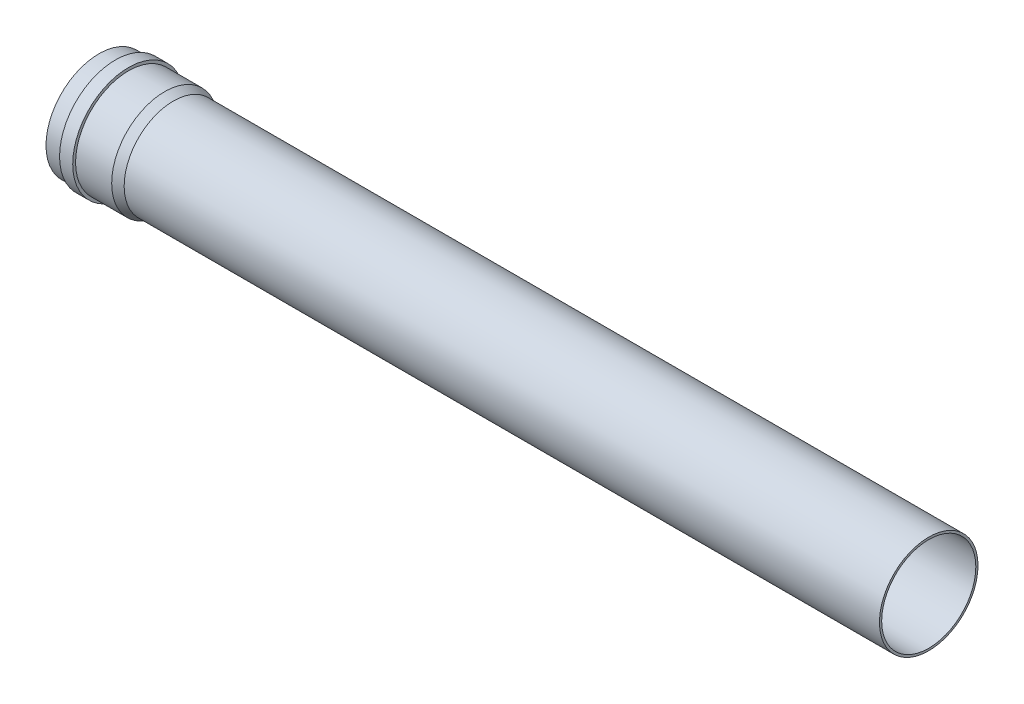
ISO-10303-21;
HEADER;
FILE_DESCRIPTION(('STEP AP214'),'2;1');
FILE_NAME('part.step','',(''),(''),'','','');
FILE_SCHEMA(('AUTOMOTIVE_DESIGN { 1 0 10303 214 1 1 1 1 }'));
ENDSEC;
DATA;
#1=APPLICATION_CONTEXT('core data for automotive mechanical design processes');
#2=APPLICATION_PROTOCOL_DEFINITION('international standard','automotive_design',2000,#1);
#3=PRODUCT_CONTEXT('',#1,'mechanical');
#4=PRODUCT('Part','Part','',(#3));
#5=PRODUCT_RELATED_PRODUCT_CATEGORY('part','',(#4));
#6=PRODUCT_DEFINITION_FORMATION('','',#4);
#7=PRODUCT_DEFINITION_CONTEXT('part definition',#1,'design');
#8=PRODUCT_DEFINITION('design','',#6,#7);
#9=PRODUCT_DEFINITION_SHAPE('','',#8);
#10=(LENGTH_UNIT() NAMED_UNIT(*) SI_UNIT(.MILLI.,.METRE.));
#11=(NAMED_UNIT(*) PLANE_ANGLE_UNIT() SI_UNIT($,.RADIAN.));
#12=(NAMED_UNIT(*) SI_UNIT($,.STERADIAN.) SOLID_ANGLE_UNIT());
#13=UNCERTAINTY_MEASURE_WITH_UNIT(LENGTH_MEASURE(1.E-05),#10,'distance_accuracy_value','');
#14=(GEOMETRIC_REPRESENTATION_CONTEXT(3) GLOBAL_UNCERTAINTY_ASSIGNED_CONTEXT((#13)) GLOBAL_UNIT_ASSIGNED_CONTEXT((#10,
#11,#12)) REPRESENTATION_CONTEXT('',''));
#15=CARTESIAN_POINT('',(0.,0.,0.));
#16=DIRECTION('',(0.,0.,1.));
#17=DIRECTION('',(1.,0.,0.));
#18=AXIS2_PLACEMENT_3D('',#15,#16,#17);
#19=CARTESIAN_POINT('',(-41.,0.,0.));
#20=DIRECTION('',(-1.,0.,0.));
#21=DIRECTION('',(0.,0.,1.));
#22=AXIS2_PLACEMENT_3D('',#19,#20,#21);
#23=CYLINDRICAL_SURFACE('',#22,51.);
#24=CARTESIAN_POINT('',(-41.,0.,0.));
#25=DIRECTION('',(-1.,0.,0.));
#26=DIRECTION('',(0.,0.,1.));
#27=AXIS2_PLACEMENT_3D('',#24,#25,#26);
#28=CIRCLE('',#27,51.);
#29=CARTESIAN_POINT('',(-41.,0.,51.));
#30=VERTEX_POINT('',#29);
#31=EDGE_CURVE('E11',#30,#30,#28,.T.);
#32=ORIENTED_EDGE('',*,*,#31,.T.);
#33=EDGE_LOOP('',(#32));
#34=FACE_BOUND('',#33,.T.);
#35=CARTESIAN_POINT('',(-53.,0.,0.));
#36=DIRECTION('',(-1.,0.,0.));
#37=DIRECTION('',(0.,0.,1.));
#38=AXIS2_PLACEMENT_3D('',#35,#36,#37);
#39=CIRCLE('',#38,51.);
#40=CARTESIAN_POINT('',(-53.,0.,51.));
#41=VERTEX_POINT('',#40);
#42=EDGE_CURVE('E52',#41,#41,#39,.T.);
#43=ORIENTED_EDGE('',*,*,#42,.F.);
#44=EDGE_LOOP('',(#43));
#45=FACE_BOUND('',#44,.T.);
#46=ADVANCED_FACE('F42',(#34,#45),#23,.T.);
#47=CARTESIAN_POINT('',(-41.,0.,0.));
#48=DIRECTION('',(-1.,0.,0.));
#49=DIRECTION('',(0.,0.,1.));
#50=AXIS2_PLACEMENT_3D('',#47,#48,#49);
#51=CYLINDRICAL_SURFACE('',#50,48.3957985296767);
#52=CARTESIAN_POINT('',(-41.,0.,0.));
#53=DIRECTION('',(-1.,0.,0.));
#54=DIRECTION('',(0.,0.,1.));
#55=AXIS2_PLACEMENT_3D('',#52,#53,#54);
#56=CIRCLE('',#55,48.3957985296767);
#57=CARTESIAN_POINT('',(-41.,0.,48.3957985296767));
#58=VERTEX_POINT('',#57);
#59=EDGE_CURVE('E48',#58,#58,#56,.T.);
#60=ORIENTED_EDGE('',*,*,#59,.F.);
#61=EDGE_LOOP('',(#60));
#62=FACE_BOUND('',#61,.T.);
#63=CARTESIAN_POINT('',(-53.,0.,0.));
#64=DIRECTION('',(-1.,0.,0.));
#65=DIRECTION('',(0.,0.,1.));
#66=AXIS2_PLACEMENT_3D('',#63,#64,#65);
#67=CIRCLE('',#66,48.3957985296767);
#68=CARTESIAN_POINT('',(-53.,0.,48.3957985296767));
#69=VERTEX_POINT('',#68);
#70=EDGE_CURVE('E56',#69,#69,#67,.T.);
#71=ORIENTED_EDGE('',*,*,#70,.T.);
#72=EDGE_LOOP('',(#71));
#73=FACE_BOUND('',#72,.T.);
#74=ADVANCED_FACE('F62',(#62,#73),#51,.F.);
#75=CARTESIAN_POINT('',(-41.,0.,0.));
#76=DIRECTION('',(-1.,0.,0.));
#77=DIRECTION('',(0.,0.,1.));
#78=AXIS2_PLACEMENT_3D('',#75,#76,#77);
#79=PLANE('',#78);
#80=ORIENTED_EDGE('',*,*,#59,.T.);
#81=EDGE_LOOP('',(#80));
#82=FACE_BOUND('',#81,.T.);
#83=ORIENTED_EDGE('',*,*,#31,.F.);
#84=EDGE_LOOP('',(#83));
#85=FACE_BOUND('',#84,.T.);
#86=ADVANCED_FACE('F67',(#82,#85),#79,.F.);
#87=CARTESIAN_POINT('',(-53.,0.,0.));
#88=DIRECTION('',(-1.,0.,0.));
#89=DIRECTION('',(0.,0.,1.));
#90=AXIS2_PLACEMENT_3D('',#87,#88,#89);
#91=PLANE('',#90);
#92=ORIENTED_EDGE('',*,*,#70,.F.);
#93=EDGE_LOOP('',(#92));
#94=FACE_BOUND('',#93,.T.);
#95=ORIENTED_EDGE('',*,*,#42,.T.);
#96=EDGE_LOOP('',(#95));
#97=FACE_BOUND('',#96,.T.);
#98=ADVANCED_FACE('F64',(#94,#97),#91,.T.);
#99=CLOSED_SHELL('',(#46,#74,#86,#98));
#100=MANIFOLD_SOLID_BREP('B2',#99);
#101=CARTESIAN_POINT('',(690.,0.,0.));
#102=DIRECTION('',(1.,0.,0.));
#103=DIRECTION('',(0.,0.,-1.));
#104=AXIS2_PLACEMENT_3D('',#101,#102,#103);
#105=PLANE('',#104);
#106=CARTESIAN_POINT('',(690.,0.,0.));
#107=DIRECTION('',(1.,0.,0.));
#108=DIRECTION('',(0.,0.,-1.));
#109=AXIS2_PLACEMENT_3D('',#106,#107,#108);
#110=CIRCLE('',#109,45.);
#111=CARTESIAN_POINT('',(690.,0.,-45.));
#112=VERTEX_POINT('',#111);
#113=EDGE_CURVE('E119',#112,#112,#110,.T.);
#114=ORIENTED_EDGE('',*,*,#113,.T.);
#115=EDGE_LOOP('',(#114));
#116=FACE_BOUND('',#115,.T.);
#117=CARTESIAN_POINT('',(690.,0.,0.));
#118=DIRECTION('',(1.,0.,0.));
#119=DIRECTION('',(0.,0.,-1.));
#120=AXIS2_PLACEMENT_3D('',#117,#118,#119);
#121=CIRCLE('',#120,43.);
#122=CARTESIAN_POINT('',(690.,0.,-43.));
#123=VERTEX_POINT('',#122);
#124=EDGE_CURVE('E125',#123,#123,#121,.T.);
#125=ORIENTED_EDGE('',*,*,#124,.F.);
#126=EDGE_LOOP('',(#125));
#127=FACE_BOUND('',#126,.T.);
#128=ADVANCED_FACE('F103',(#116,#127),#105,.T.);
#129=CARTESIAN_POINT('',(690.,0.,0.));
#130=DIRECTION('',(-1.,0.,0.));
#131=DIRECTION('',(0.,0.,1.));
#132=AXIS2_PLACEMENT_3D('',#129,#130,#131);
#133=CYLINDRICAL_SURFACE('',#132,45.);
#134=ORIENTED_EDGE('',*,*,#113,.F.);
#135=EDGE_LOOP('',(#134));
#136=FACE_BOUND('',#135,.T.);
#137=CARTESIAN_POINT('',(0.,0.,0.));
#138=DIRECTION('',(1.,0.,0.));
#139=DIRECTION('',(0.,0.,-1.));
#140=AXIS2_PLACEMENT_3D('',#137,#138,#139);
#141=CIRCLE('',#140,45.);
#142=CARTESIAN_POINT('',(0.,0.,-45.));
#143=VERTEX_POINT('',#142);
#144=EDGE_CURVE('E122',#143,#143,#141,.T.);
#145=ORIENTED_EDGE('',*,*,#144,.T.);
#146=EDGE_LOOP('',(#145));
#147=FACE_BOUND('',#146,.T.);
#148=ADVANCED_FACE('F154',(#136,#147),#133,.T.);
#149=CARTESIAN_POINT('',(690.,0.,0.));
#150=DIRECTION('',(-1.,0.,0.));
#151=DIRECTION('',(0.,0.,1.));
#152=AXIS2_PLACEMENT_3D('',#149,#150,#151);
#153=CYLINDRICAL_SURFACE('',#152,43.);
#154=CARTESIAN_POINT('',(-0.13887129133594,0.,0.));
#155=DIRECTION('',(-1.,0.,0.));
#156=DIRECTION('',(0.,0.,1.));
#157=AXIS2_PLACEMENT_3D('',#154,#155,#156);
#158=CIRCLE('',#157,43.);
#159=CARTESIAN_POINT('',(-0.13887129133594,0.,43.));
#160=VERTEX_POINT('',#159);
#161=EDGE_CURVE('E111',#160,#160,#158,.T.);
#162=ORIENTED_EDGE('',*,*,#161,.T.);
#163=EDGE_LOOP('',(#162));
#164=FACE_BOUND('',#163,.T.);
#165=ORIENTED_EDGE('',*,*,#124,.T.);
#166=EDGE_LOOP('',(#165));
#167=FACE_BOUND('',#166,.T.);
#168=ADVANCED_FACE('F160',(#164,#167),#153,.F.);
#169=CARTESIAN_POINT('',(-8.24548328038335,0.,0.));
#170=DIRECTION('',(-1.,0.,0.));
#171=DIRECTION('',(0.,0.,1.));
#172=AXIS2_PLACEMENT_3D('',#169,#170,#171);
#173=CONICAL_SURFACE('',#172,48.5,0.401425727958692);
#174=ORIENTED_EDGE('',*,*,#144,.F.);
#175=EDGE_LOOP('',(#174));
#176=FACE_BOUND('',#175,.T.);
#177=CARTESIAN_POINT('',(-8.,0.,0.));
#178=DIRECTION('',(-1.,0.,0.));
#179=DIRECTION('',(0.,0.,1.));
#180=AXIS2_PLACEMENT_3D('',#177,#178,#179);
#181=CIRCLE('',#180,48.3957985296767);
#182=CARTESIAN_POINT('',(-8.,0.,48.3957985296767));
#183=VERTEX_POINT('',#182);
#184=EDGE_CURVE('E115',#183,#183,#181,.T.);
#185=ORIENTED_EDGE('',*,*,#184,.F.);
#186=EDGE_LOOP('',(#185));
#187=FACE_BOUND('',#186,.T.);
#188=ADVANCED_FACE('F150',(#176,#187),#173,.T.);
#189=CARTESIAN_POINT('',(-0.13887129133594,0.,0.));
#190=DIRECTION('',(-1.,0.,0.));
#191=DIRECTION('',(0.,0.,1.));
#192=AXIS2_PLACEMENT_3D('',#189,#190,#191);
#193=CONICAL_SURFACE('',#192,43.,0.418879020478641);
#194=CARTESIAN_POINT('',(-8.,0.,0.));
#195=DIRECTION('',(-1.,0.,0.));
#196=DIRECTION('',(0.,0.,1.));
#197=AXIS2_PLACEMENT_3D('',#194,#195,#196);
#198=CIRCLE('',#197,46.4999999999997);
#199=CARTESIAN_POINT('',(-8.,0.,46.4999999999997));
#200=VERTEX_POINT('',#199);
#201=EDGE_CURVE('E41',#200,#200,#198,.F.);
#202=ORIENTED_EDGE('',*,*,#201,.F.);
#203=EDGE_LOOP('',(#202));
#204=FACE_BOUND('',#203,.T.);
#205=ORIENTED_EDGE('',*,*,#161,.F.);
#206=EDGE_LOOP('',(#205));
#207=FACE_BOUND('',#206,.T.);
#208=ADVANCED_FACE('F106',(#204,#207),#193,.F.);
#209=CARTESIAN_POINT('',(-68.,0.,0.));
#210=DIRECTION('',(-1.,0.,0.));
#211=DIRECTION('',(0.,0.,1.));
#212=AXIS2_PLACEMENT_3D('',#209,#210,#211);
#213=PLANE('',#212);
#214=CARTESIAN_POINT('',(-68.,0.,0.));
#215=DIRECTION('',(-1.,0.,0.));
#216=DIRECTION('',(0.,0.,1.));
#217=AXIS2_PLACEMENT_3D('',#214,#215,#216);
#218=CIRCLE('',#217,48.3957985296767);
#219=CARTESIAN_POINT('',(-68.,0.,48.3957985296767));
#220=VERTEX_POINT('',#219);
#221=EDGE_CURVE('E126',#220,#220,#218,.T.);
#222=ORIENTED_EDGE('',*,*,#221,.T.);
#223=EDGE_LOOP('',(#222));
#224=FACE_BOUND('',#223,.T.);
#225=CARTESIAN_POINT('',(-68.,0.,0.));
#226=DIRECTION('',(-1.,0.,0.));
#227=DIRECTION('',(0.,0.,1.));
#228=AXIS2_PLACEMENT_3D('',#225,#226,#227);
#229=CIRCLE('',#228,46.4999999999997);
#230=CARTESIAN_POINT('',(-68.,0.,46.4999999999997));
#231=VERTEX_POINT('',#230);
#232=EDGE_CURVE('E133',#231,#231,#229,.T.);
#233=ORIENTED_EDGE('',*,*,#232,.F.);
#234=EDGE_LOOP('',(#233));
#235=FACE_BOUND('',#234,.T.);
#236=ADVANCED_FACE('F139',(#224,#235),#213,.T.);
#237=CARTESIAN_POINT('',(-68.,0.,0.));
#238=DIRECTION('',(1.,0.,0.));
#239=DIRECTION('',(0.,0.,-1.));
#240=AXIS2_PLACEMENT_3D('',#237,#238,#239);
#241=CYLINDRICAL_SURFACE('',#240,48.3957985296767);
#242=ORIENTED_EDGE('',*,*,#221,.F.);
#243=EDGE_LOOP('',(#242));
#244=FACE_BOUND('',#243,.T.);
#245=ORIENTED_EDGE('',*,*,#184,.T.);
#246=EDGE_LOOP('',(#245));
#247=FACE_BOUND('',#246,.T.);
#248=ADVANCED_FACE('F141',(#244,#247),#241,.T.);
#249=CARTESIAN_POINT('',(-68.,0.,0.));
#250=DIRECTION('',(1.,0.,0.));
#251=DIRECTION('',(0.,0.,-1.));
#252=AXIS2_PLACEMENT_3D('',#249,#250,#251);
#253=CYLINDRICAL_SURFACE('',#252,46.4999999999997);
#254=ORIENTED_EDGE('',*,*,#232,.T.);
#255=EDGE_LOOP('',(#254));
#256=FACE_BOUND('',#255,.T.);
#257=ORIENTED_EDGE('',*,*,#201,.T.);
#258=EDGE_LOOP('',(#257));
#259=FACE_BOUND('',#258,.T.);
#260=ADVANCED_FACE('F137',(#256,#259),#253,.F.);
#261=CLOSED_SHELL('',(#128,#148,#168,#188,#208,#236,#248,#260));
#262=MANIFOLD_SOLID_BREP('B6',#261);
#263=ADVANCED_BREP_SHAPE_REPRESENTATION('',(#18,#100,#262),#14);
#264=SHAPE_DEFINITION_REPRESENTATION(#9,#263);
ENDSEC;
END-ISO-10303-21;
